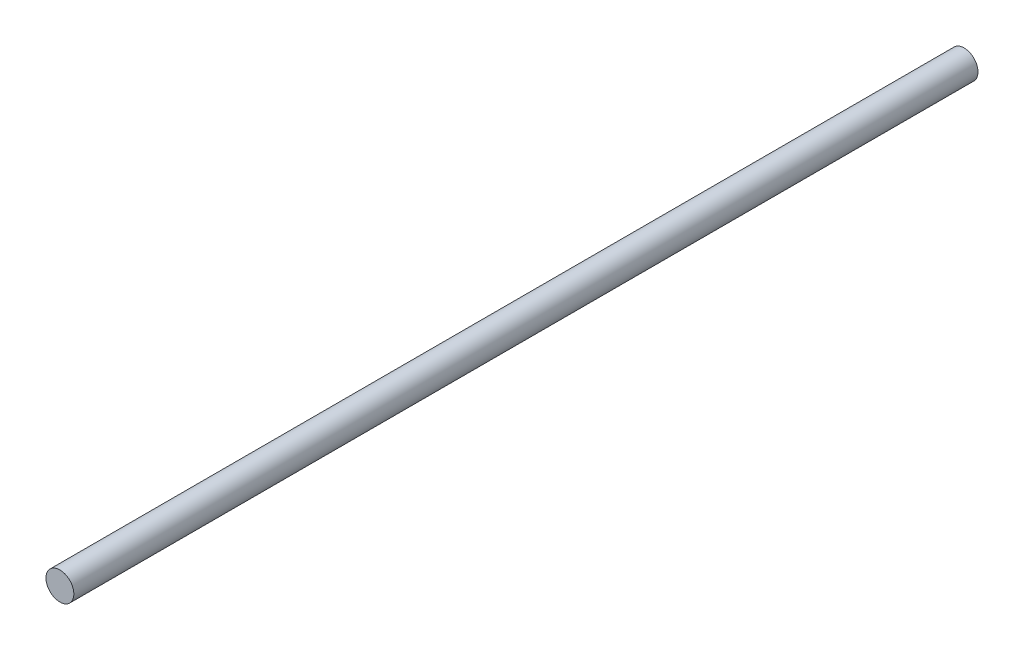
ISO-10303-21;
HEADER;
FILE_DESCRIPTION(('STEP AP214'),'2;1');
FILE_NAME('part.step','',(''),(''),'','','');
FILE_SCHEMA(('AUTOMOTIVE_DESIGN { 1 0 10303 214 1 1 1 1 }'));
ENDSEC;
DATA;
#1=APPLICATION_CONTEXT('core data for automotive mechanical design processes');
#2=APPLICATION_PROTOCOL_DEFINITION('international standard','automotive_design',2000,#1);
#3=PRODUCT_CONTEXT('',#1,'mechanical');
#4=PRODUCT('Part','Part','',(#3));
#5=PRODUCT_RELATED_PRODUCT_CATEGORY('part','',(#4));
#6=PRODUCT_DEFINITION_FORMATION('','',#4);
#7=PRODUCT_DEFINITION_CONTEXT('part definition',#1,'design');
#8=PRODUCT_DEFINITION('design','',#6,#7);
#9=PRODUCT_DEFINITION_SHAPE('','',#8);
#10=(LENGTH_UNIT() NAMED_UNIT(*) SI_UNIT(.MILLI.,.METRE.));
#11=(NAMED_UNIT(*) PLANE_ANGLE_UNIT() SI_UNIT($,.RADIAN.));
#12=(NAMED_UNIT(*) SI_UNIT($,.STERADIAN.) SOLID_ANGLE_UNIT());
#13=UNCERTAINTY_MEASURE_WITH_UNIT(LENGTH_MEASURE(1.E-05),#10,'distance_accuracy_value','');
#14=(GEOMETRIC_REPRESENTATION_CONTEXT(3) GLOBAL_UNCERTAINTY_ASSIGNED_CONTEXT((#13)) GLOBAL_UNIT_ASSIGNED_CONTEXT((#10,
#11,#12)) REPRESENTATION_CONTEXT('',''));
#15=CARTESIAN_POINT('',(0.,0.,0.));
#16=DIRECTION('',(0.,0.,1.));
#17=DIRECTION('',(1.,0.,0.));
#18=AXIS2_PLACEMENT_3D('',#15,#16,#17);
#19=CARTESIAN_POINT('',(0.,0.,194.8));
#20=DIRECTION('',(0.,0.,-1.));
#21=DIRECTION('',(-1.,0.,0.));
#22=AXIS2_PLACEMENT_3D('',#19,#20,#21);
#23=CYLINDRICAL_SURFACE('',#22,3.);
#24=CARTESIAN_POINT('',(0.,0.,194.8));
#25=DIRECTION('',(0.,0.,1.));
#26=DIRECTION('',(1.,0.,0.));
#27=AXIS2_PLACEMENT_3D('',#24,#25,#26);
#28=CIRCLE('',#27,3.);
#29=CARTESIAN_POINT('',(3.,0.,194.8));
#30=VERTEX_POINT('',#29);
#31=EDGE_CURVE('E10',#30,#30,#28,.T.);
#32=ORIENTED_EDGE('',*,*,#31,.F.);
#33=EDGE_LOOP('',(#32));
#34=FACE_BOUND('',#33,.T.);
#35=CARTESIAN_POINT('',(0.,0.,0.));
#36=DIRECTION('',(0.,0.,1.));
#37=DIRECTION('',(1.,0.,0.));
#38=AXIS2_PLACEMENT_3D('',#35,#36,#37);
#39=CIRCLE('',#38,3.);
#40=CARTESIAN_POINT('',(3.,0.,0.));
#41=VERTEX_POINT('',#40);
#42=EDGE_CURVE('E34',#41,#41,#39,.T.);
#43=ORIENTED_EDGE('',*,*,#42,.T.);
#44=EDGE_LOOP('',(#43));
#45=FACE_BOUND('',#44,.T.);
#46=ADVANCED_FACE('F31',(#34,#45),#23,.T.);
#47=CARTESIAN_POINT('',(0.,0.,194.8));
#48=DIRECTION('',(0.,0.,1.));
#49=DIRECTION('',(1.,0.,0.));
#50=AXIS2_PLACEMENT_3D('',#47,#48,#49);
#51=PLANE('',#50);
#52=ORIENTED_EDGE('',*,*,#31,.T.);
#53=EDGE_LOOP('',(#52));
#54=FACE_BOUND('',#53,.T.);
#55=ADVANCED_FACE('F46',(#54),#51,.T.);
#56=CARTESIAN_POINT('',(0.,0.,0.));
#57=DIRECTION('',(0.,0.,1.));
#58=DIRECTION('',(1.,0.,0.));
#59=AXIS2_PLACEMENT_3D('',#56,#57,#58);
#60=PLANE('',#59);
#61=ORIENTED_EDGE('',*,*,#42,.F.);
#62=EDGE_LOOP('',(#61));
#63=FACE_BOUND('',#62,.T.);
#64=ADVANCED_FACE('F44',(#63),#60,.F.);
#65=CLOSED_SHELL('',(#46,#55,#64));
#66=MANIFOLD_SOLID_BREP('B2',#65);
#67=ADVANCED_BREP_SHAPE_REPRESENTATION('',(#18,#66),#14);
#68=SHAPE_DEFINITION_REPRESENTATION(#9,#67);
ENDSEC;
END-ISO-10303-21;
